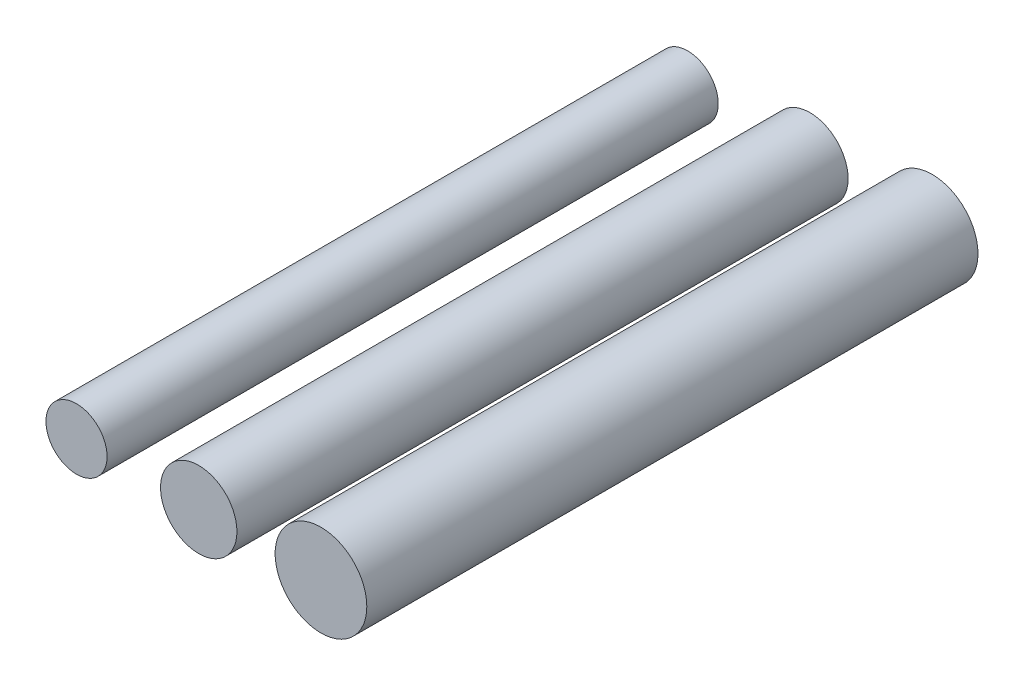
ISO-10303-21;
HEADER;
FILE_DESCRIPTION(('STEP AP214'),'2;1');
FILE_NAME('part.step','',(''),(''),'','','');
FILE_SCHEMA(('AUTOMOTIVE_DESIGN { 1 0 10303 214 1 1 1 1 }'));
ENDSEC;
DATA;
#1=APPLICATION_CONTEXT('core data for automotive mechanical design processes');
#2=APPLICATION_PROTOCOL_DEFINITION('international standard','automotive_design',2000,#1);
#3=PRODUCT_CONTEXT('',#1,'mechanical');
#4=PRODUCT('Part','Part','',(#3));
#5=PRODUCT_RELATED_PRODUCT_CATEGORY('part','',(#4));
#6=PRODUCT_DEFINITION_FORMATION('','',#4);
#7=PRODUCT_DEFINITION_CONTEXT('part definition',#1,'design');
#8=PRODUCT_DEFINITION('design','',#6,#7);
#9=PRODUCT_DEFINITION_SHAPE('','',#8);
#10=(LENGTH_UNIT() NAMED_UNIT(*) SI_UNIT(.MILLI.,.METRE.));
#11=(NAMED_UNIT(*) PLANE_ANGLE_UNIT() SI_UNIT($,.RADIAN.));
#12=(NAMED_UNIT(*) SI_UNIT($,.STERADIAN.) SOLID_ANGLE_UNIT());
#13=UNCERTAINTY_MEASURE_WITH_UNIT(LENGTH_MEASURE(1.E-05),#10,'distance_accuracy_value','');
#14=(GEOMETRIC_REPRESENTATION_CONTEXT(3) GLOBAL_UNCERTAINTY_ASSIGNED_CONTEXT((#13)) GLOBAL_UNIT_ASSIGNED_CONTEXT((#10,
#11,#12)) REPRESENTATION_CONTEXT('',''));
#15=CARTESIAN_POINT('',(0.,0.,0.));
#16=DIRECTION('',(0.,0.,1.));
#17=DIRECTION('',(1.,0.,0.));
#18=AXIS2_PLACEMENT_3D('',#15,#16,#17);
#19=CARTESIAN_POINT('',(10.16,0.,25.4));
#20=DIRECTION('',(0.,0.,-1.));
#21=DIRECTION('',(-1.,0.,0.));
#22=AXIS2_PLACEMENT_3D('',#19,#20,#21);
#23=CYLINDRICAL_SURFACE('',#22,1.905);
#24=CARTESIAN_POINT('',(10.16,0.,25.4));
#25=DIRECTION('',(0.,0.,1.));
#26=DIRECTION('',(1.,0.,0.));
#27=AXIS2_PLACEMENT_3D('',#24,#25,#26);
#28=CIRCLE('',#27,1.905);
#29=CARTESIAN_POINT('',(12.065,0.,25.4));
#30=VERTEX_POINT('',#29);
#31=EDGE_CURVE('E11',#30,#30,#28,.T.);
#32=ORIENTED_EDGE('',*,*,#31,.F.);
#33=EDGE_LOOP('',(#32));
#34=FACE_BOUND('',#33,.T.);
#35=CARTESIAN_POINT('',(10.16,0.,0.));
#36=DIRECTION('',(0.,0.,1.));
#37=DIRECTION('',(1.,0.,0.));
#38=AXIS2_PLACEMENT_3D('',#35,#36,#37);
#39=CIRCLE('',#38,1.905);
#40=CARTESIAN_POINT('',(12.065,0.,0.));
#41=VERTEX_POINT('',#40);
#42=EDGE_CURVE('E49',#41,#41,#39,.T.);
#43=ORIENTED_EDGE('',*,*,#42,.T.);
#44=EDGE_LOOP('',(#43));
#45=FACE_BOUND('',#44,.T.);
#46=ADVANCED_FACE('F46',(#34,#45),#23,.T.);
#47=CARTESIAN_POINT('',(10.16,0.,25.4));
#48=DIRECTION('',(0.,0.,1.));
#49=DIRECTION('',(1.,0.,0.));
#50=AXIS2_PLACEMENT_3D('',#47,#48,#49);
#51=PLANE('',#50);
#52=ORIENTED_EDGE('',*,*,#31,.T.);
#53=EDGE_LOOP('',(#52));
#54=FACE_BOUND('',#53,.T.);
#55=ADVANCED_FACE('F63',(#54),#51,.T.);
#56=CARTESIAN_POINT('',(10.16,0.,0.));
#57=DIRECTION('',(0.,0.,1.));
#58=DIRECTION('',(1.,0.,0.));
#59=AXIS2_PLACEMENT_3D('',#56,#57,#58);
#60=PLANE('',#59);
#61=ORIENTED_EDGE('',*,*,#42,.F.);
#62=EDGE_LOOP('',(#61));
#63=FACE_BOUND('',#62,.T.);
#64=ADVANCED_FACE('F61',(#63),#60,.F.);
#65=CLOSED_SHELL('',(#46,#55,#64));
#66=MANIFOLD_SOLID_BREP('B2',#65);
#67=CARTESIAN_POINT('',(5.08,0.,25.4));
#68=DIRECTION('',(0.,0.,-1.));
#69=DIRECTION('',(-1.,0.,0.));
#70=AXIS2_PLACEMENT_3D('',#67,#68,#69);
#71=CYLINDRICAL_SURFACE('',#70,1.5875);
#72=CARTESIAN_POINT('',(5.08,0.,25.4));
#73=DIRECTION('',(0.,0.,1.));
#74=DIRECTION('',(1.,0.,0.));
#75=AXIS2_PLACEMENT_3D('',#72,#73,#74);
#76=CIRCLE('',#75,1.5875);
#77=CARTESIAN_POINT('',(6.6675,0.,25.4));
#78=VERTEX_POINT('',#77);
#79=EDGE_CURVE('E45',#78,#78,#76,.T.);
#80=ORIENTED_EDGE('',*,*,#79,.F.);
#81=EDGE_LOOP('',(#80));
#82=FACE_BOUND('',#81,.T.);
#83=CARTESIAN_POINT('',(5.08,0.,0.));
#84=DIRECTION('',(0.,0.,1.));
#85=DIRECTION('',(1.,0.,0.));
#86=AXIS2_PLACEMENT_3D('',#83,#84,#85);
#87=CIRCLE('',#86,1.5875);
#88=CARTESIAN_POINT('',(6.6675,0.,0.));
#89=VERTEX_POINT('',#88);
#90=EDGE_CURVE('E99',#89,#89,#87,.T.);
#91=ORIENTED_EDGE('',*,*,#90,.T.);
#92=EDGE_LOOP('',(#91));
#93=FACE_BOUND('',#92,.T.);
#94=ADVANCED_FACE('F96',(#82,#93),#71,.T.);
#95=CARTESIAN_POINT('',(5.08,0.,25.4));
#96=DIRECTION('',(0.,0.,1.));
#97=DIRECTION('',(1.,0.,0.));
#98=AXIS2_PLACEMENT_3D('',#95,#96,#97);
#99=PLANE('',#98);
#100=ORIENTED_EDGE('',*,*,#79,.T.);
#101=EDGE_LOOP('',(#100));
#102=FACE_BOUND('',#101,.T.);
#103=ADVANCED_FACE('F111',(#102),#99,.T.);
#104=CARTESIAN_POINT('',(5.08,0.,0.));
#105=DIRECTION('',(0.,0.,1.));
#106=DIRECTION('',(1.,0.,0.));
#107=AXIS2_PLACEMENT_3D('',#104,#105,#106);
#108=PLANE('',#107);
#109=ORIENTED_EDGE('',*,*,#90,.F.);
#110=EDGE_LOOP('',(#109));
#111=FACE_BOUND('',#110,.T.);
#112=ADVANCED_FACE('F109',(#111),#108,.F.);
#113=CLOSED_SHELL('',(#94,#103,#112));
#114=MANIFOLD_SOLID_BREP('B6',#113);
#115=CARTESIAN_POINT('',(0.,0.,25.4));
#116=DIRECTION('',(0.,0.,-1.));
#117=DIRECTION('',(-1.,0.,0.));
#118=AXIS2_PLACEMENT_3D('',#115,#116,#117);
#119=CYLINDRICAL_SURFACE('',#118,1.27);
#120=CARTESIAN_POINT('',(0.,0.,25.4));
#121=DIRECTION('',(0.,0.,1.));
#122=DIRECTION('',(1.,0.,0.));
#123=AXIS2_PLACEMENT_3D('',#120,#121,#122);
#124=CIRCLE('',#123,1.27);
#125=CARTESIAN_POINT('',(1.27,0.,25.4));
#126=VERTEX_POINT('',#125);
#127=EDGE_CURVE('E95',#126,#126,#124,.T.);
#128=ORIENTED_EDGE('',*,*,#127,.F.);
#129=EDGE_LOOP('',(#128));
#130=FACE_BOUND('',#129,.T.);
#131=CARTESIAN_POINT('',(0.,0.,0.));
#132=DIRECTION('',(0.,0.,1.));
#133=DIRECTION('',(1.,0.,0.));
#134=AXIS2_PLACEMENT_3D('',#131,#132,#133);
#135=CIRCLE('',#134,1.27);
#136=CARTESIAN_POINT('',(1.27,0.,0.));
#137=VERTEX_POINT('',#136);
#138=EDGE_CURVE('E140',#137,#137,#135,.T.);
#139=ORIENTED_EDGE('',*,*,#138,.T.);
#140=EDGE_LOOP('',(#139));
#141=FACE_BOUND('',#140,.T.);
#142=ADVANCED_FACE('F137',(#130,#141),#119,.T.);
#143=CARTESIAN_POINT('',(0.,0.,25.4));
#144=DIRECTION('',(0.,0.,1.));
#145=DIRECTION('',(1.,0.,0.));
#146=AXIS2_PLACEMENT_3D('',#143,#144,#145);
#147=PLANE('',#146);
#148=ORIENTED_EDGE('',*,*,#127,.T.);
#149=EDGE_LOOP('',(#148));
#150=FACE_BOUND('',#149,.T.);
#151=ADVANCED_FACE('F152',(#150),#147,.T.);
#152=CARTESIAN_POINT('',(0.,0.,0.));
#153=DIRECTION('',(0.,0.,1.));
#154=DIRECTION('',(1.,0.,0.));
#155=AXIS2_PLACEMENT_3D('',#152,#153,#154);
#156=PLANE('',#155);
#157=ORIENTED_EDGE('',*,*,#138,.F.);
#158=EDGE_LOOP('',(#157));
#159=FACE_BOUND('',#158,.T.);
#160=ADVANCED_FACE('F150',(#159),#156,.F.);
#161=CLOSED_SHELL('',(#142,#151,#160));
#162=MANIFOLD_SOLID_BREP('B40',#161);
#163=ADVANCED_BREP_SHAPE_REPRESENTATION('',(#18,#66,#114,#162),#14);
#164=SHAPE_DEFINITION_REPRESENTATION(#9,#163);
ENDSEC;
END-ISO-10303-21;
